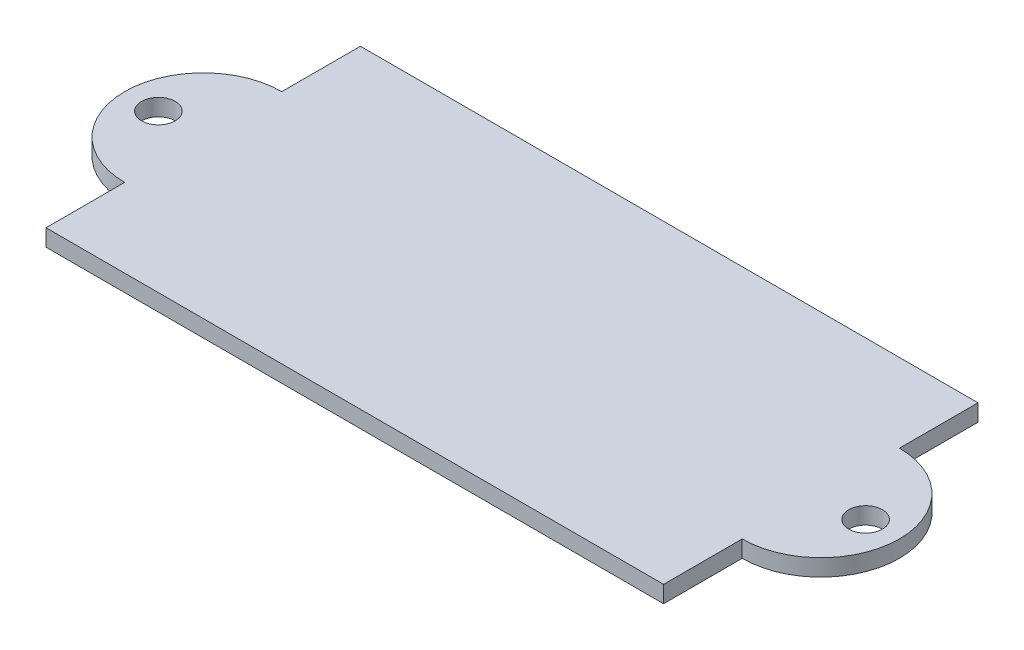
ISO-10303-21;
HEADER;
FILE_DESCRIPTION(('STEP AP214'),'2;1');
FILE_NAME('part.step','',(''),(''),'','','');
FILE_SCHEMA(('AUTOMOTIVE_DESIGN { 1 0 10303 214 1 1 1 1 }'));
ENDSEC;
DATA;
#1=APPLICATION_CONTEXT('core data for automotive mechanical design processes');
#2=APPLICATION_PROTOCOL_DEFINITION('international standard','automotive_design',2000,#1);
#3=PRODUCT_CONTEXT('',#1,'mechanical');
#4=PRODUCT('Part','Part','',(#3));
#5=PRODUCT_RELATED_PRODUCT_CATEGORY('part','',(#4));
#6=PRODUCT_DEFINITION_FORMATION('','',#4);
#7=PRODUCT_DEFINITION_CONTEXT('part definition',#1,'design');
#8=PRODUCT_DEFINITION('design','',#6,#7);
#9=PRODUCT_DEFINITION_SHAPE('','',#8);
#10=(LENGTH_UNIT() NAMED_UNIT(*) SI_UNIT(.MILLI.,.METRE.));
#11=(NAMED_UNIT(*) PLANE_ANGLE_UNIT() SI_UNIT($,.RADIAN.));
#12=(NAMED_UNIT(*) SI_UNIT($,.STERADIAN.) SOLID_ANGLE_UNIT());
#13=UNCERTAINTY_MEASURE_WITH_UNIT(LENGTH_MEASURE(1.E-05),#10,'distance_accuracy_value','');
#14=(GEOMETRIC_REPRESENTATION_CONTEXT(3) GLOBAL_UNCERTAINTY_ASSIGNED_CONTEXT((#13)) GLOBAL_UNIT_ASSIGNED_CONTEXT((#10,
#11,#12)) REPRESENTATION_CONTEXT('',''));
#15=CARTESIAN_POINT('',(0.,0.,0.));
#16=DIRECTION('',(0.,0.,1.));
#17=DIRECTION('',(1.,0.,0.));
#18=AXIS2_PLACEMENT_3D('',#15,#16,#17);
#19=CARTESIAN_POINT('',(27.5,-1.5,0.));
#20=DIRECTION('',(-1.,0.,0.));
#21=DIRECTION('',(0.,0.,1.));
#22=AXIS2_PLACEMENT_3D('',#19,#20,#21);
#23=PLANE('',#22);
#24=DIRECTION('',(0.,0.,1.));
#25=VECTOR('',#24,1.);
#26=CARTESIAN_POINT('',(27.5,0.,0.));
#27=LINE('',#26,#25);
#28=CARTESIAN_POINT('',(27.5,0.,-14.));
#29=VERTEX_POINT('',#28);
#30=CARTESIAN_POINT('',(27.5,0.,-7.00000000000001));
#31=VERTEX_POINT('',#30);
#32=EDGE_CURVE('E147',#29,#31,#27,.T.);
#33=ORIENTED_EDGE('',*,*,#32,.T.);
#34=DIRECTION('',(0.,1.,0.));
#35=VECTOR('',#34,1.);
#36=CARTESIAN_POINT('',(27.5,-1.5,-7.00000000000001));
#37=LINE('',#36,#35);
#38=CARTESIAN_POINT('',(27.5,-1.5,-7.00000000000001));
#39=VERTEX_POINT('',#38);
#40=EDGE_CURVE('E11',#39,#31,#37,.T.);
#41=ORIENTED_EDGE('',*,*,#40,.F.);
#42=DIRECTION('',(0.,0.,1.));
#43=VECTOR('',#42,1.);
#44=CARTESIAN_POINT('',(27.5,-1.5,0.));
#45=LINE('',#44,#43);
#46=CARTESIAN_POINT('',(27.5,-1.5,-14.));
#47=VERTEX_POINT('',#46);
#48=EDGE_CURVE('E124',#47,#39,#45,.T.);
#49=ORIENTED_EDGE('',*,*,#48,.F.);
#50=DIRECTION('',(0.,1.,0.));
#51=VECTOR('',#50,1.);
#52=CARTESIAN_POINT('',(27.5,-1.5,-14.));
#53=LINE('',#52,#51);
#54=EDGE_CURVE('E45',#47,#29,#53,.T.);
#55=ORIENTED_EDGE('',*,*,#54,.T.);
#56=EDGE_LOOP('',(#33,#41,#49,#55));
#57=FACE_BOUND('',#56,.T.);
#58=ADVANCED_FACE('F41',(#57),#23,.F.);
#59=CARTESIAN_POINT('',(27.5,-1.5,0.));
#60=DIRECTION('',(0.,1.,0.));
#61=DIRECTION('',(0.,0.,1.));
#62=AXIS2_PLACEMENT_3D('',#59,#60,#61);
#63=CYLINDRICAL_SURFACE('',#62,7.);
#64=CARTESIAN_POINT('',(27.5,0.,0.));
#65=DIRECTION('',(0.,1.,0.));
#66=DIRECTION('',(0.,0.,1.));
#67=AXIS2_PLACEMENT_3D('',#64,#65,#66);
#68=CIRCLE('',#67,7.);
#69=CARTESIAN_POINT('',(27.5,0.,6.99999999999999));
#70=VERTEX_POINT('',#69);
#71=EDGE_CURVE('E86',#31,#70,#68,.F.);
#72=ORIENTED_EDGE('',*,*,#71,.T.);
#73=DIRECTION('',(0.,1.,0.));
#74=VECTOR('',#73,1.);
#75=CARTESIAN_POINT('',(27.5,-1.5,6.99999999999999));
#76=LINE('',#75,#74);
#77=CARTESIAN_POINT('',(27.5,-1.5,6.99999999999999));
#78=VERTEX_POINT('',#77);
#79=EDGE_CURVE('E52',#78,#70,#76,.T.);
#80=ORIENTED_EDGE('',*,*,#79,.F.);
#81=CARTESIAN_POINT('',(27.5,-1.5,0.));
#82=DIRECTION('',(0.,1.,0.));
#83=DIRECTION('',(0.,0.,1.));
#84=AXIS2_PLACEMENT_3D('',#81,#82,#83);
#85=CIRCLE('',#84,7.);
#86=EDGE_CURVE('E60',#39,#78,#85,.F.);
#87=ORIENTED_EDGE('',*,*,#86,.F.);
#88=ORIENTED_EDGE('',*,*,#40,.T.);
#89=EDGE_LOOP('',(#72,#80,#87,#88));
#90=FACE_BOUND('',#89,.T.);
#91=ADVANCED_FACE('F234',(#90),#63,.T.);
#92=CARTESIAN_POINT('',(27.5,0.,14.));
#93=VERTEX_POINT('',#92);
#94=EDGE_CURVE('E128',#70,#93,#27,.T.);
#95=ORIENTED_EDGE('',*,*,#94,.T.);
#96=DIRECTION('',(0.,1.,0.));
#97=VECTOR('',#96,1.);
#98=CARTESIAN_POINT('',(27.5,-1.5,14.));
#99=LINE('',#98,#97);
#100=CARTESIAN_POINT('',(27.5,-1.5,14.));
#101=VERTEX_POINT('',#100);
#102=EDGE_CURVE('E126',#101,#93,#99,.T.);
#103=ORIENTED_EDGE('',*,*,#102,.F.);
#104=EDGE_CURVE('E114',#78,#101,#45,.T.);
#105=ORIENTED_EDGE('',*,*,#104,.F.);
#106=ORIENTED_EDGE('',*,*,#79,.T.);
#107=EDGE_LOOP('',(#95,#103,#105,#106));
#108=FACE_BOUND('',#107,.T.);
#109=ADVANCED_FACE('F127',(#108),#23,.F.);
#110=CARTESIAN_POINT('',(0.,-1.5,14.));
#111=DIRECTION('',(0.,0.,1.));
#112=DIRECTION('',(1.,0.,0.));
#113=AXIS2_PLACEMENT_3D('',#110,#111,#112);
#114=PLANE('',#113);
#115=DIRECTION('',(1.,0.,0.));
#116=VECTOR('',#115,1.);
#117=CARTESIAN_POINT('',(0.,0.,14.));
#118=LINE('',#117,#116);
#119=CARTESIAN_POINT('',(-27.5,0.,14.));
#120=VERTEX_POINT('',#119);
#121=EDGE_CURVE('E164',#120,#93,#118,.T.);
#122=ORIENTED_EDGE('',*,*,#121,.F.);
#123=DIRECTION('',(0.,1.,0.));
#124=VECTOR('',#123,1.);
#125=CARTESIAN_POINT('',(-27.5,-1.5,14.));
#126=LINE('',#125,#124);
#127=CARTESIAN_POINT('',(-27.5,-1.5,14.));
#128=VERTEX_POINT('',#127);
#129=EDGE_CURVE('E133',#128,#120,#126,.T.);
#130=ORIENTED_EDGE('',*,*,#129,.F.);
#131=DIRECTION('',(1.,0.,0.));
#132=VECTOR('',#131,1.);
#133=CARTESIAN_POINT('',(0.,-1.5,14.));
#134=LINE('',#133,#132);
#135=EDGE_CURVE('E119',#128,#101,#134,.T.);
#136=ORIENTED_EDGE('',*,*,#135,.T.);
#137=ORIENTED_EDGE('',*,*,#102,.T.);
#138=EDGE_LOOP('',(#122,#130,#136,#137));
#139=FACE_BOUND('',#138,.T.);
#140=ADVANCED_FACE('F135',(#139),#114,.T.);
#141=CARTESIAN_POINT('',(-27.5,-1.5,0.));
#142=DIRECTION('',(-1.,0.,0.));
#143=DIRECTION('',(0.,0.,1.));
#144=AXIS2_PLACEMENT_3D('',#141,#142,#143);
#145=PLANE('',#144);
#146=DIRECTION('',(0.,0.,1.));
#147=VECTOR('',#146,1.);
#148=CARTESIAN_POINT('',(-27.5,0.,0.));
#149=LINE('',#148,#147);
#150=CARTESIAN_POINT('',(-27.5,0.,7.));
#151=VERTEX_POINT('',#150);
#152=EDGE_CURVE('E160',#151,#120,#149,.T.);
#153=ORIENTED_EDGE('',*,*,#152,.F.);
#154=DIRECTION('',(0.,1.,0.));
#155=VECTOR('',#154,1.);
#156=CARTESIAN_POINT('',(-27.5,-1.5,7.));
#157=LINE('',#156,#155);
#158=CARTESIAN_POINT('',(-27.5,-1.5,7.));
#159=VERTEX_POINT('',#158);
#160=EDGE_CURVE('E173',#159,#151,#157,.T.);
#161=ORIENTED_EDGE('',*,*,#160,.F.);
#162=DIRECTION('',(0.,0.,1.));
#163=VECTOR('',#162,1.);
#164=CARTESIAN_POINT('',(-27.5,-1.5,0.));
#165=LINE('',#164,#163);
#166=EDGE_CURVE('E137',#159,#128,#165,.T.);
#167=ORIENTED_EDGE('',*,*,#166,.T.);
#168=ORIENTED_EDGE('',*,*,#129,.T.);
#169=EDGE_LOOP('',(#153,#161,#167,#168));
#170=FACE_BOUND('',#169,.T.);
#171=ADVANCED_FACE('F224',(#170),#145,.T.);
#172=CARTESIAN_POINT('',(-27.5,-1.5,0.));
#173=DIRECTION('',(0.,1.,0.));
#174=DIRECTION('',(0.,0.,1.));
#175=AXIS2_PLACEMENT_3D('',#172,#173,#174);
#176=CYLINDRICAL_SURFACE('',#175,7.);
#177=CARTESIAN_POINT('',(-27.5,0.,0.));
#178=DIRECTION('',(0.,1.,0.));
#179=DIRECTION('',(0.,0.,1.));
#180=AXIS2_PLACEMENT_3D('',#177,#178,#179);
#181=CIRCLE('',#180,7.);
#182=CARTESIAN_POINT('',(-27.5,0.,-7.));
#183=VERTEX_POINT('',#182);
#184=EDGE_CURVE('E159',#183,#151,#181,.T.);
#185=ORIENTED_EDGE('',*,*,#184,.F.);
#186=DIRECTION('',(0.,1.,0.));
#187=VECTOR('',#186,1.);
#188=CARTESIAN_POINT('',(-27.5,-1.5,-7.));
#189=LINE('',#188,#187);
#190=CARTESIAN_POINT('',(-27.5,-1.5,-7.));
#191=VERTEX_POINT('',#190);
#192=EDGE_CURVE('E176',#191,#183,#189,.T.);
#193=ORIENTED_EDGE('',*,*,#192,.F.);
#194=CARTESIAN_POINT('',(-27.5,-1.5,0.));
#195=DIRECTION('',(0.,1.,0.));
#196=DIRECTION('',(0.,0.,1.));
#197=AXIS2_PLACEMENT_3D('',#194,#195,#196);
#198=CIRCLE('',#197,7.);
#199=EDGE_CURVE('E140',#191,#159,#198,.T.);
#200=ORIENTED_EDGE('',*,*,#199,.T.);
#201=ORIENTED_EDGE('',*,*,#160,.T.);
#202=EDGE_LOOP('',(#185,#193,#200,#201));
#203=FACE_BOUND('',#202,.T.);
#204=ADVANCED_FACE('F196',(#203),#176,.T.);
#205=CARTESIAN_POINT('',(-27.5,0.,-14.));
#206=VERTEX_POINT('',#205);
#207=EDGE_CURVE('E155',#206,#183,#149,.T.);
#208=ORIENTED_EDGE('',*,*,#207,.F.);
#209=DIRECTION('',(0.,1.,0.));
#210=VECTOR('',#209,1.);
#211=CARTESIAN_POINT('',(-27.5,-1.5,-14.));
#212=LINE('',#211,#210);
#213=CARTESIAN_POINT('',(-27.5,-1.5,-14.));
#214=VERTEX_POINT('',#213);
#215=EDGE_CURVE('E178',#214,#206,#212,.T.);
#216=ORIENTED_EDGE('',*,*,#215,.F.);
#217=EDGE_CURVE('E142',#214,#191,#165,.T.);
#218=ORIENTED_EDGE('',*,*,#217,.T.);
#219=ORIENTED_EDGE('',*,*,#192,.T.);
#220=EDGE_LOOP('',(#208,#216,#218,#219));
#221=FACE_BOUND('',#220,.T.);
#222=ADVANCED_FACE('F190',(#221),#145,.T.);
#223=CARTESIAN_POINT('',(0.,-1.5,-14.));
#224=DIRECTION('',(0.,0.,1.));
#225=DIRECTION('',(1.,0.,0.));
#226=AXIS2_PLACEMENT_3D('',#223,#224,#225);
#227=PLANE('',#226);
#228=DIRECTION('',(1.,0.,0.));
#229=VECTOR('',#228,1.);
#230=CARTESIAN_POINT('',(0.,0.,-14.));
#231=LINE('',#230,#229);
#232=EDGE_CURVE('E151',#206,#29,#231,.T.);
#233=ORIENTED_EDGE('',*,*,#232,.T.);
#234=ORIENTED_EDGE('',*,*,#54,.F.);
#235=DIRECTION('',(1.,0.,0.));
#236=VECTOR('',#235,1.);
#237=CARTESIAN_POINT('',(0.,-1.5,-14.));
#238=LINE('',#237,#236);
#239=EDGE_CURVE('E98',#214,#47,#238,.T.);
#240=ORIENTED_EDGE('',*,*,#239,.F.);
#241=ORIENTED_EDGE('',*,*,#215,.T.);
#242=EDGE_LOOP('',(#233,#234,#240,#241));
#243=FACE_BOUND('',#242,.T.);
#244=ADVANCED_FACE('F43',(#243),#227,.F.);
#245=CARTESIAN_POINT('',(0.,-1.5,0.));
#246=DIRECTION('',(0.,1.,0.));
#247=DIRECTION('',(0.,0.,1.));
#248=AXIS2_PLACEMENT_3D('',#245,#246,#247);
#249=PLANE('',#248);
#250=CARTESIAN_POINT('',(-31.49,-1.5,0.));
#251=DIRECTION('',(0.,1.,0.));
#252=DIRECTION('',(0.,0.,1.));
#253=AXIS2_PLACEMENT_3D('',#250,#251,#252);
#254=CIRCLE('',#253,1.5);
#255=CARTESIAN_POINT('',(-31.49,-1.5,1.50000000000001));
#256=VERTEX_POINT('',#255);
#257=EDGE_CURVE('E152',#256,#256,#254,.T.);
#258=ORIENTED_EDGE('',*,*,#257,.T.);
#259=EDGE_LOOP('',(#258));
#260=FACE_BOUND('',#259,.T.);
#261=CARTESIAN_POINT('',(31.49,-1.5,0.));
#262=DIRECTION('',(0.,1.,0.));
#263=DIRECTION('',(0.,0.,1.));
#264=AXIS2_PLACEMENT_3D('',#261,#262,#263);
#265=CIRCLE('',#264,1.5);
#266=CARTESIAN_POINT('',(31.49,-1.5,1.5));
#267=VERTEX_POINT('',#266);
#268=EDGE_CURVE('E209',#267,#267,#265,.T.);
#269=ORIENTED_EDGE('',*,*,#268,.T.);
#270=EDGE_LOOP('',(#269));
#271=FACE_BOUND('',#270,.T.);
#272=ORIENTED_EDGE('',*,*,#48,.T.);
#273=ORIENTED_EDGE('',*,*,#86,.T.);
#274=ORIENTED_EDGE('',*,*,#104,.T.);
#275=ORIENTED_EDGE('',*,*,#135,.F.);
#276=ORIENTED_EDGE('',*,*,#166,.F.);
#277=ORIENTED_EDGE('',*,*,#199,.F.);
#278=ORIENTED_EDGE('',*,*,#217,.F.);
#279=ORIENTED_EDGE('',*,*,#239,.T.);
#280=EDGE_LOOP('',(#272,#273,#274,#275,#276,#277,#278,#279));
#281=FACE_BOUND('',#280,.T.);
#282=ADVANCED_FACE('F116',(#260,#271,#281),#249,.F.);
#283=CARTESIAN_POINT('',(0.,0.,0.));
#284=DIRECTION('',(0.,1.,0.));
#285=DIRECTION('',(0.,0.,1.));
#286=AXIS2_PLACEMENT_3D('',#283,#284,#285);
#287=PLANE('',#286);
#288=CARTESIAN_POINT('',(-31.49,0.,0.));
#289=DIRECTION('',(0.,1.,0.));
#290=DIRECTION('',(0.,0.,1.));
#291=AXIS2_PLACEMENT_3D('',#288,#289,#290);
#292=CIRCLE('',#291,1.5);
#293=CARTESIAN_POINT('',(-31.49,0.,1.50000000000001));
#294=VERTEX_POINT('',#293);
#295=EDGE_CURVE('E205',#294,#294,#292,.T.);
#296=ORIENTED_EDGE('',*,*,#295,.F.);
#297=EDGE_LOOP('',(#296));
#298=FACE_BOUND('',#297,.T.);
#299=CARTESIAN_POINT('',(31.49,0.,0.));
#300=DIRECTION('',(0.,1.,0.));
#301=DIRECTION('',(0.,0.,1.));
#302=AXIS2_PLACEMENT_3D('',#299,#300,#301);
#303=CIRCLE('',#302,1.5);
#304=CARTESIAN_POINT('',(31.49,0.,1.5));
#305=VERTEX_POINT('',#304);
#306=EDGE_CURVE('E213',#305,#305,#303,.T.);
#307=ORIENTED_EDGE('',*,*,#306,.F.);
#308=EDGE_LOOP('',(#307));
#309=FACE_BOUND('',#308,.T.);
#310=ORIENTED_EDGE('',*,*,#32,.F.);
#311=ORIENTED_EDGE('',*,*,#232,.F.);
#312=ORIENTED_EDGE('',*,*,#207,.T.);
#313=ORIENTED_EDGE('',*,*,#184,.T.);
#314=ORIENTED_EDGE('',*,*,#152,.T.);
#315=ORIENTED_EDGE('',*,*,#121,.T.);
#316=ORIENTED_EDGE('',*,*,#94,.F.);
#317=ORIENTED_EDGE('',*,*,#71,.F.);
#318=EDGE_LOOP('',(#310,#311,#312,#313,#314,#315,#316,#317));
#319=FACE_BOUND('',#318,.T.);
#320=ADVANCED_FACE('F187',(#298,#309,#319),#287,.T.);
#321=CARTESIAN_POINT('',(31.49,-1.5,0.));
#322=DIRECTION('',(0.,1.,0.));
#323=DIRECTION('',(0.,0.,1.));
#324=AXIS2_PLACEMENT_3D('',#321,#322,#323);
#325=CYLINDRICAL_SURFACE('',#324,1.5);
#326=ORIENTED_EDGE('',*,*,#268,.F.);
#327=EDGE_LOOP('',(#326));
#328=FACE_BOUND('',#327,.T.);
#329=ORIENTED_EDGE('',*,*,#306,.T.);
#330=EDGE_LOOP('',(#329));
#331=FACE_BOUND('',#330,.T.);
#332=ADVANCED_FACE('F293',(#328,#331),#325,.F.);
#333=CARTESIAN_POINT('',(-31.49,-1.5,0.));
#334=DIRECTION('',(0.,1.,0.));
#335=DIRECTION('',(0.,0.,1.));
#336=AXIS2_PLACEMENT_3D('',#333,#334,#335);
#337=CYLINDRICAL_SURFACE('',#336,1.5);
#338=ORIENTED_EDGE('',*,*,#257,.F.);
#339=EDGE_LOOP('',(#338));
#340=FACE_BOUND('',#339,.T.);
#341=ORIENTED_EDGE('',*,*,#295,.T.);
#342=EDGE_LOOP('',(#341));
#343=FACE_BOUND('',#342,.T.);
#344=ADVANCED_FACE('F304',(#340,#343),#337,.F.);
#345=CLOSED_SHELL('',(#58,#91,#109,#140,#171,#204,#222,#244,#282,#320,#332,#344));
#346=MANIFOLD_SOLID_BREP('B2',#345);
#347=ADVANCED_BREP_SHAPE_REPRESENTATION('',(#18,#346),#14);
#348=SHAPE_DEFINITION_REPRESENTATION(#9,#347);
ENDSEC;
END-ISO-10303-21;
